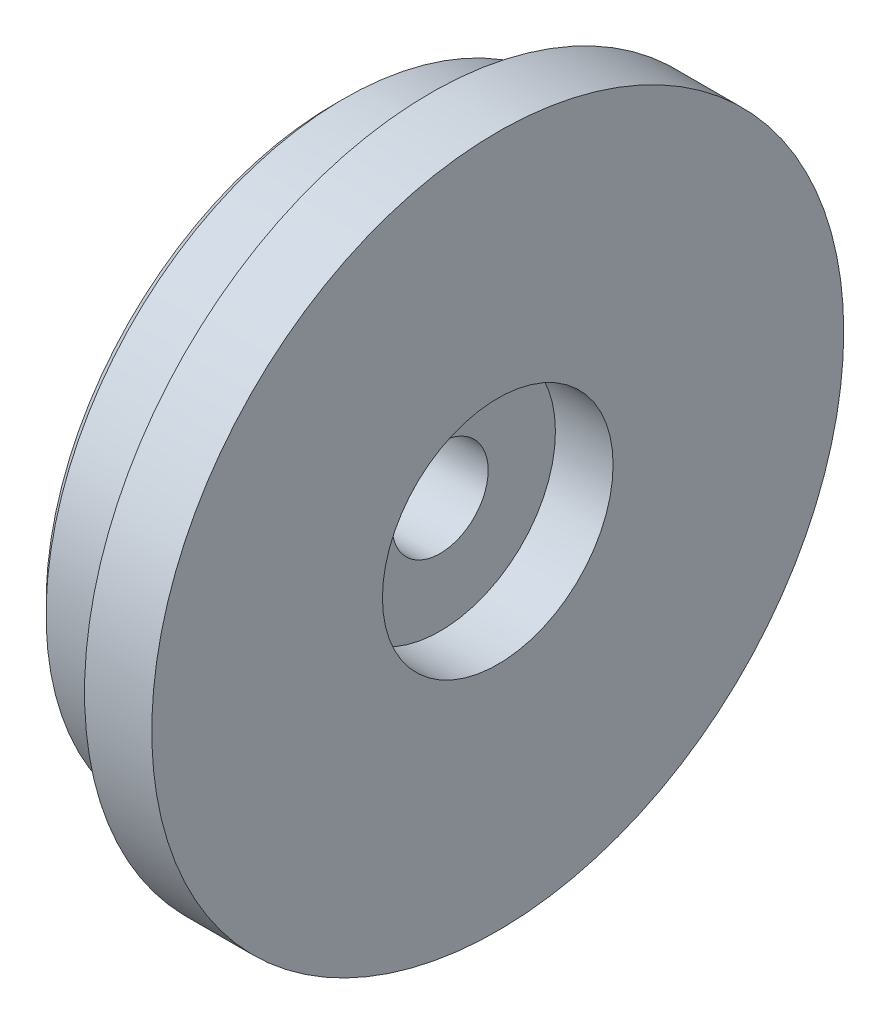
ISO-10303-21;
HEADER;
FILE_DESCRIPTION(('STEP AP214'),'2;1');
FILE_NAME('part.step','',(''),(''),'','','');
FILE_SCHEMA(('AUTOMOTIVE_DESIGN { 1 0 10303 214 1 1 1 1 }'));
ENDSEC;
DATA;
#1=APPLICATION_CONTEXT('core data for automotive mechanical design processes');
#2=APPLICATION_PROTOCOL_DEFINITION('international standard','automotive_design',2000,#1);
#3=PRODUCT_CONTEXT('',#1,'mechanical');
#4=PRODUCT('Part','Part','',(#3));
#5=PRODUCT_RELATED_PRODUCT_CATEGORY('part','',(#4));
#6=PRODUCT_DEFINITION_FORMATION('','',#4);
#7=PRODUCT_DEFINITION_CONTEXT('part definition',#1,'design');
#8=PRODUCT_DEFINITION('design','',#6,#7);
#9=PRODUCT_DEFINITION_SHAPE('','',#8);
#10=(LENGTH_UNIT() NAMED_UNIT(*) SI_UNIT(.MILLI.,.METRE.));
#11=(NAMED_UNIT(*) PLANE_ANGLE_UNIT() SI_UNIT($,.RADIAN.));
#12=(NAMED_UNIT(*) SI_UNIT($,.STERADIAN.) SOLID_ANGLE_UNIT());
#13=UNCERTAINTY_MEASURE_WITH_UNIT(LENGTH_MEASURE(1.E-05),#10,'distance_accuracy_value','');
#14=(GEOMETRIC_REPRESENTATION_CONTEXT(3) GLOBAL_UNCERTAINTY_ASSIGNED_CONTEXT((#13)) GLOBAL_UNIT_ASSIGNED_CONTEXT((#10,
#11,#12)) REPRESENTATION_CONTEXT('',''));
#15=CARTESIAN_POINT('',(0.,0.,0.));
#16=DIRECTION('',(0.,0.,1.));
#17=DIRECTION('',(1.,0.,0.));
#18=AXIS2_PLACEMENT_3D('',#15,#16,#17);
#19=CARTESIAN_POINT('',(0.,18.,0.));
#20=DIRECTION('',(1.,0.,0.));
#21=DIRECTION('',(0.,0.,-1.));
#22=AXIS2_PLACEMENT_3D('',#19,#20,#21);
#23=PLANE('',#22);
#24=CARTESIAN_POINT('',(0.,0.,0.));
#25=DIRECTION('',(1.,0.,0.));
#26=DIRECTION('',(0.,0.,-1.));
#27=AXIS2_PLACEMENT_3D('',#24,#25,#26);
#28=CIRCLE('',#27,18.);
#29=CARTESIAN_POINT('',(0.,0.,-18.));
#30=VERTEX_POINT('',#29);
#31=EDGE_CURVE('E104',#30,#30,#28,.T.);
#32=ORIENTED_EDGE('',*,*,#31,.T.);
#33=EDGE_LOOP('',(#32));
#34=FACE_BOUND('',#33,.T.);
#35=CARTESIAN_POINT('',(0.,0.,0.));
#36=DIRECTION('',(1.,0.,0.));
#37=DIRECTION('',(0.,0.,-1.));
#38=AXIS2_PLACEMENT_3D('',#35,#36,#37);
#39=CIRCLE('',#38,6.);
#40=CARTESIAN_POINT('',(0.,0.,-6.));
#41=VERTEX_POINT('',#40);
#42=EDGE_CURVE('E10',#41,#41,#39,.T.);
#43=ORIENTED_EDGE('',*,*,#42,.F.);
#44=EDGE_LOOP('',(#43));
#45=FACE_BOUND('',#44,.T.);
#46=ADVANCED_FACE('F49',(#34,#45),#23,.T.);
#47=CARTESIAN_POINT('',(0.,0.,0.));
#48=DIRECTION('',(1.,0.,0.));
#49=DIRECTION('',(0.,0.,-1.));
#50=AXIS2_PLACEMENT_3D('',#47,#48,#49);
#51=CYLINDRICAL_SURFACE('',#50,6.);
#52=ORIENTED_EDGE('',*,*,#42,.T.);
#53=EDGE_LOOP('',(#52));
#54=FACE_BOUND('',#53,.T.);
#55=CARTESIAN_POINT('',(-3.,0.,0.));
#56=DIRECTION('',(1.,0.,0.));
#57=DIRECTION('',(0.,0.,-1.));
#58=AXIS2_PLACEMENT_3D('',#55,#56,#57);
#59=CIRCLE('',#58,6.);
#60=CARTESIAN_POINT('',(-3.,0.,-6.));
#61=VERTEX_POINT('',#60);
#62=EDGE_CURVE('E55',#61,#61,#59,.T.);
#63=ORIENTED_EDGE('',*,*,#62,.F.);
#64=EDGE_LOOP('',(#63));
#65=FACE_BOUND('',#64,.T.);
#66=ADVANCED_FACE('F122',(#54,#65),#51,.F.);
#67=CARTESIAN_POINT('',(-3.,6.,0.));
#68=DIRECTION('',(1.,0.,0.));
#69=DIRECTION('',(0.,0.,-1.));
#70=AXIS2_PLACEMENT_3D('',#67,#68,#69);
#71=PLANE('',#70);
#72=ORIENTED_EDGE('',*,*,#62,.T.);
#73=EDGE_LOOP('',(#72));
#74=FACE_BOUND('',#73,.T.);
#75=CARTESIAN_POINT('',(-3.,0.,0.));
#76=DIRECTION('',(1.,0.,0.));
#77=DIRECTION('',(0.,0.,-1.));
#78=AXIS2_PLACEMENT_3D('',#75,#76,#77);
#79=CIRCLE('',#78,2.5);
#80=CARTESIAN_POINT('',(-3.,0.,-2.5));
#81=VERTEX_POINT('',#80);
#82=EDGE_CURVE('E59',#81,#81,#79,.T.);
#83=ORIENTED_EDGE('',*,*,#82,.F.);
#84=EDGE_LOOP('',(#83));
#85=FACE_BOUND('',#84,.T.);
#86=ADVANCED_FACE('F126',(#74,#85),#71,.T.);
#87=CARTESIAN_POINT('',(0.,0.,0.));
#88=DIRECTION('',(1.,0.,0.));
#89=DIRECTION('',(0.,0.,-1.));
#90=AXIS2_PLACEMENT_3D('',#87,#88,#89);
#91=CYLINDRICAL_SURFACE('',#90,2.5);
#92=ORIENTED_EDGE('',*,*,#82,.T.);
#93=EDGE_LOOP('',(#92));
#94=FACE_BOUND('',#93,.T.);
#95=CARTESIAN_POINT('',(-8.5,0.,0.));
#96=DIRECTION('',(1.,0.,0.));
#97=DIRECTION('',(0.,0.,-1.));
#98=AXIS2_PLACEMENT_3D('',#95,#96,#97);
#99=CIRCLE('',#98,2.5);
#100=CARTESIAN_POINT('',(-8.5,0.,-2.5));
#101=VERTEX_POINT('',#100);
#102=EDGE_CURVE('E63',#101,#101,#99,.T.);
#103=ORIENTED_EDGE('',*,*,#102,.F.);
#104=EDGE_LOOP('',(#103));
#105=FACE_BOUND('',#104,.T.);
#106=ADVANCED_FACE('F130',(#94,#105),#91,.F.);
#107=CARTESIAN_POINT('',(-8.5,2.5,0.));
#108=DIRECTION('',(-1.,0.,0.));
#109=DIRECTION('',(0.,0.,1.));
#110=AXIS2_PLACEMENT_3D('',#107,#108,#109);
#111=PLANE('',#110);
#112=ORIENTED_EDGE('',*,*,#102,.T.);
#113=EDGE_LOOP('',(#112));
#114=FACE_BOUND('',#113,.T.);
#115=CARTESIAN_POINT('',(-8.5,0.,0.));
#116=DIRECTION('',(1.,0.,0.));
#117=DIRECTION('',(0.,0.,-1.));
#118=AXIS2_PLACEMENT_3D('',#115,#116,#117);
#119=CIRCLE('',#118,5.);
#120=CARTESIAN_POINT('',(-8.5,0.,-5.));
#121=VERTEX_POINT('',#120);
#122=EDGE_CURVE('E68',#121,#121,#119,.T.);
#123=ORIENTED_EDGE('',*,*,#122,.F.);
#124=EDGE_LOOP('',(#123));
#125=FACE_BOUND('',#124,.T.);
#126=ADVANCED_FACE('F136',(#114,#125),#111,.T.);
#127=CARTESIAN_POINT('',(0.,0.,0.));
#128=DIRECTION('',(1.,0.,0.));
#129=DIRECTION('',(0.,0.,-1.));
#130=AXIS2_PLACEMENT_3D('',#127,#128,#129);
#131=CYLINDRICAL_SURFACE('',#130,5.);
#132=ORIENTED_EDGE('',*,*,#122,.T.);
#133=EDGE_LOOP('',(#132));
#134=FACE_BOUND('',#133,.T.);
#135=CARTESIAN_POINT('',(-5.75,0.,0.));
#136=DIRECTION('',(1.,0.,0.));
#137=DIRECTION('',(0.,0.,-1.));
#138=AXIS2_PLACEMENT_3D('',#135,#136,#137);
#139=CIRCLE('',#138,5.);
#140=CARTESIAN_POINT('',(-5.75,0.,-5.));
#141=VERTEX_POINT('',#140);
#142=EDGE_CURVE('E71',#141,#141,#139,.T.);
#143=ORIENTED_EDGE('',*,*,#142,.F.);
#144=EDGE_LOOP('',(#143));
#145=FACE_BOUND('',#144,.T.);
#146=ADVANCED_FACE('F140',(#134,#145),#131,.T.);
#147=CARTESIAN_POINT('',(-5.,0.,0.));
#148=DIRECTION('',(1.,0.,0.));
#149=DIRECTION('',(0.,0.,-1.));
#150=AXIS2_PLACEMENT_3D('',#147,#148,#149);
#151=CONICAL_SURFACE('',#150,5.75,0.785398163397448);
#152=ORIENTED_EDGE('',*,*,#142,.T.);
#153=EDGE_LOOP('',(#152));
#154=FACE_BOUND('',#153,.T.);
#155=CARTESIAN_POINT('',(-5.,0.,0.));
#156=DIRECTION('',(1.,0.,0.));
#157=DIRECTION('',(0.,0.,-1.));
#158=AXIS2_PLACEMENT_3D('',#155,#156,#157);
#159=CIRCLE('',#158,5.75);
#160=CARTESIAN_POINT('',(-5.,0.,-5.75));
#161=VERTEX_POINT('',#160);
#162=EDGE_CURVE('E74',#161,#161,#159,.T.);
#163=ORIENTED_EDGE('',*,*,#162,.F.);
#164=EDGE_LOOP('',(#163));
#165=FACE_BOUND('',#164,.T.);
#166=ADVANCED_FACE('F144',(#154,#165),#151,.T.);
#167=CARTESIAN_POINT('',(-5.,5.75,0.));
#168=DIRECTION('',(-1.,0.,0.));
#169=DIRECTION('',(0.,0.,1.));
#170=AXIS2_PLACEMENT_3D('',#167,#168,#169);
#171=PLANE('',#170);
#172=ORIENTED_EDGE('',*,*,#162,.T.);
#173=EDGE_LOOP('',(#172));
#174=FACE_BOUND('',#173,.T.);
#175=CARTESIAN_POINT('',(-5.,0.,0.));
#176=DIRECTION('',(1.,0.,0.));
#177=DIRECTION('',(0.,0.,-1.));
#178=AXIS2_PLACEMENT_3D('',#175,#176,#177);
#179=CIRCLE('',#178,11.25);
#180=CARTESIAN_POINT('',(-5.,0.,-11.25));
#181=VERTEX_POINT('',#180);
#182=EDGE_CURVE('E77',#181,#181,#179,.T.);
#183=ORIENTED_EDGE('',*,*,#182,.F.);
#184=EDGE_LOOP('',(#183));
#185=FACE_BOUND('',#184,.T.);
#186=ADVANCED_FACE('F148',(#174,#185),#171,.T.);
#187=CARTESIAN_POINT('',(-5.75,0.,0.));
#188=DIRECTION('',(-1.,0.,0.));
#189=DIRECTION('',(0.,0.,1.));
#190=AXIS2_PLACEMENT_3D('',#187,#188,#189);
#191=CONICAL_SURFACE('',#190,12.,0.785398163397449);
#192=ORIENTED_EDGE('',*,*,#182,.T.);
#193=EDGE_LOOP('',(#192));
#194=FACE_BOUND('',#193,.T.);
#195=CARTESIAN_POINT('',(-5.75,0.,0.));
#196=DIRECTION('',(1.,0.,0.));
#197=DIRECTION('',(0.,0.,-1.));
#198=AXIS2_PLACEMENT_3D('',#195,#196,#197);
#199=CIRCLE('',#198,12.);
#200=CARTESIAN_POINT('',(-5.75,0.,-12.));
#201=VERTEX_POINT('',#200);
#202=EDGE_CURVE('E80',#201,#201,#199,.T.);
#203=ORIENTED_EDGE('',*,*,#202,.F.);
#204=EDGE_LOOP('',(#203));
#205=FACE_BOUND('',#204,.T.);
#206=ADVANCED_FACE('F152',(#194,#205),#191,.F.);
#207=CARTESIAN_POINT('',(0.,0.,0.));
#208=DIRECTION('',(1.,0.,0.));
#209=DIRECTION('',(0.,0.,-1.));
#210=AXIS2_PLACEMENT_3D('',#207,#208,#209);
#211=CYLINDRICAL_SURFACE('',#210,12.);
#212=ORIENTED_EDGE('',*,*,#202,.T.);
#213=EDGE_LOOP('',(#212));
#214=FACE_BOUND('',#213,.T.);
#215=CARTESIAN_POINT('',(-8.5,0.,0.));
#216=DIRECTION('',(1.,0.,0.));
#217=DIRECTION('',(0.,0.,-1.));
#218=AXIS2_PLACEMENT_3D('',#215,#216,#217);
#219=CIRCLE('',#218,12.);
#220=CARTESIAN_POINT('',(-8.5,0.,-12.));
#221=VERTEX_POINT('',#220);
#222=EDGE_CURVE('E83',#221,#221,#219,.T.);
#223=ORIENTED_EDGE('',*,*,#222,.F.);
#224=EDGE_LOOP('',(#223));
#225=FACE_BOUND('',#224,.T.);
#226=ADVANCED_FACE('F156',(#214,#225),#211,.F.);
#227=CARTESIAN_POINT('',(-8.5,12.,0.));
#228=DIRECTION('',(-1.,0.,0.));
#229=DIRECTION('',(0.,0.,1.));
#230=AXIS2_PLACEMENT_3D('',#227,#228,#229);
#231=PLANE('',#230);
#232=ORIENTED_EDGE('',*,*,#222,.T.);
#233=EDGE_LOOP('',(#232));
#234=FACE_BOUND('',#233,.T.);
#235=CARTESIAN_POINT('',(-8.5,0.,0.));
#236=DIRECTION('',(1.,0.,0.));
#237=DIRECTION('',(0.,0.,-1.));
#238=AXIS2_PLACEMENT_3D('',#235,#236,#237);
#239=CIRCLE('',#238,15.);
#240=CARTESIAN_POINT('',(-8.5,0.,-15.));
#241=VERTEX_POINT('',#240);
#242=EDGE_CURVE('E86',#241,#241,#239,.T.);
#243=ORIENTED_EDGE('',*,*,#242,.F.);
#244=EDGE_LOOP('',(#243));
#245=FACE_BOUND('',#244,.T.);
#246=ADVANCED_FACE('F160',(#234,#245),#231,.T.);
#247=CARTESIAN_POINT('',(-8.,0.,0.));
#248=DIRECTION('',(1.,0.,0.));
#249=DIRECTION('',(0.,0.,-1.));
#250=AXIS2_PLACEMENT_3D('',#247,#248,#249);
#251=CONICAL_SURFACE('',#250,15.5,0.785398163397448);
#252=ORIENTED_EDGE('',*,*,#242,.T.);
#253=EDGE_LOOP('',(#252));
#254=FACE_BOUND('',#253,.T.);
#255=CARTESIAN_POINT('',(-8.,0.,0.));
#256=DIRECTION('',(1.,0.,0.));
#257=DIRECTION('',(0.,0.,-1.));
#258=AXIS2_PLACEMENT_3D('',#255,#256,#257);
#259=CIRCLE('',#258,15.5);
#260=CARTESIAN_POINT('',(-8.,0.,-15.5));
#261=VERTEX_POINT('',#260);
#262=EDGE_CURVE('E89',#261,#261,#259,.T.);
#263=ORIENTED_EDGE('',*,*,#262,.F.);
#264=EDGE_LOOP('',(#263));
#265=FACE_BOUND('',#264,.T.);
#266=ADVANCED_FACE('F164',(#254,#265),#251,.T.);
#267=CARTESIAN_POINT('',(0.,0.,0.));
#268=DIRECTION('',(1.,0.,0.));
#269=DIRECTION('',(0.,0.,-1.));
#270=AXIS2_PLACEMENT_3D('',#267,#268,#269);
#271=CYLINDRICAL_SURFACE('',#270,15.5);
#272=ORIENTED_EDGE('',*,*,#262,.T.);
#273=EDGE_LOOP('',(#272));
#274=FACE_BOUND('',#273,.T.);
#275=CARTESIAN_POINT('',(-4.5,0.,0.));
#276=DIRECTION('',(1.,0.,0.));
#277=DIRECTION('',(0.,0.,-1.));
#278=AXIS2_PLACEMENT_3D('',#275,#276,#277);
#279=CIRCLE('',#278,15.5);
#280=CARTESIAN_POINT('',(-4.5,0.,-15.5));
#281=VERTEX_POINT('',#280);
#282=EDGE_CURVE('E92',#281,#281,#279,.T.);
#283=ORIENTED_EDGE('',*,*,#282,.F.);
#284=EDGE_LOOP('',(#283));
#285=FACE_BOUND('',#284,.T.);
#286=ADVANCED_FACE('F168',(#274,#285),#271,.T.);
#287=CARTESIAN_POINT('',(-4.5,15.,0.));
#288=DIRECTION('',(1.,0.,0.));
#289=DIRECTION('',(0.,0.,-1.));
#290=AXIS2_PLACEMENT_3D('',#287,#288,#289);
#291=PLANE('',#290);
#292=ORIENTED_EDGE('',*,*,#282,.T.);
#293=EDGE_LOOP('',(#292));
#294=FACE_BOUND('',#293,.T.);
#295=CARTESIAN_POINT('',(-4.5,0.,0.));
#296=DIRECTION('',(1.,0.,0.));
#297=DIRECTION('',(0.,0.,-1.));
#298=AXIS2_PLACEMENT_3D('',#295,#296,#297);
#299=CIRCLE('',#298,15.);
#300=CARTESIAN_POINT('',(-4.5,0.,-15.));
#301=VERTEX_POINT('',#300);
#302=EDGE_CURVE('E95',#301,#301,#299,.T.);
#303=ORIENTED_EDGE('',*,*,#302,.F.);
#304=EDGE_LOOP('',(#303));
#305=FACE_BOUND('',#304,.T.);
#306=ADVANCED_FACE('F172',(#294,#305),#291,.T.);
#307=CARTESIAN_POINT('',(0.,0.,0.));
#308=DIRECTION('',(1.,0.,0.));
#309=DIRECTION('',(0.,0.,-1.));
#310=AXIS2_PLACEMENT_3D('',#307,#308,#309);
#311=CYLINDRICAL_SURFACE('',#310,15.);
#312=ORIENTED_EDGE('',*,*,#302,.T.);
#313=EDGE_LOOP('',(#312));
#314=FACE_BOUND('',#313,.T.);
#315=CARTESIAN_POINT('',(-3.5,0.,0.));
#316=DIRECTION('',(1.,0.,0.));
#317=DIRECTION('',(0.,0.,-1.));
#318=AXIS2_PLACEMENT_3D('',#315,#316,#317);
#319=CIRCLE('',#318,15.);
#320=CARTESIAN_POINT('',(-3.5,0.,-15.));
#321=VERTEX_POINT('',#320);
#322=EDGE_CURVE('E98',#321,#321,#319,.T.);
#323=ORIENTED_EDGE('',*,*,#322,.F.);
#324=EDGE_LOOP('',(#323));
#325=FACE_BOUND('',#324,.T.);
#326=ADVANCED_FACE('F118',(#314,#325),#311,.T.);
#327=CARTESIAN_POINT('',(-3.5,18.,0.));
#328=DIRECTION('',(-1.,0.,0.));
#329=DIRECTION('',(0.,0.,1.));
#330=AXIS2_PLACEMENT_3D('',#327,#328,#329);
#331=PLANE('',#330);
#332=ORIENTED_EDGE('',*,*,#322,.T.);
#333=EDGE_LOOP('',(#332));
#334=FACE_BOUND('',#333,.T.);
#335=CARTESIAN_POINT('',(-3.5,0.,0.));
#336=DIRECTION('',(1.,0.,0.));
#337=DIRECTION('',(0.,0.,-1.));
#338=AXIS2_PLACEMENT_3D('',#335,#336,#337);
#339=CIRCLE('',#338,18.);
#340=CARTESIAN_POINT('',(-3.5,0.,-18.));
#341=VERTEX_POINT('',#340);
#342=EDGE_CURVE('E101',#341,#341,#339,.T.);
#343=ORIENTED_EDGE('',*,*,#342,.F.);
#344=EDGE_LOOP('',(#343));
#345=FACE_BOUND('',#344,.T.);
#346=ADVANCED_FACE('F112',(#334,#345),#331,.T.);
#347=CARTESIAN_POINT('',(0.,0.,0.));
#348=DIRECTION('',(1.,0.,0.));
#349=DIRECTION('',(0.,0.,-1.));
#350=AXIS2_PLACEMENT_3D('',#347,#348,#349);
#351=CYLINDRICAL_SURFACE('',#350,18.);
#352=ORIENTED_EDGE('',*,*,#342,.T.);
#353=EDGE_LOOP('',(#352));
#354=FACE_BOUND('',#353,.T.);
#355=ORIENTED_EDGE('',*,*,#31,.F.);
#356=EDGE_LOOP('',(#355));
#357=FACE_BOUND('',#356,.T.);
#358=ADVANCED_FACE('F110',(#354,#357),#351,.T.);
#359=CLOSED_SHELL('',(#46,#66,#86,#106,#126,#146,#166,#186,#206,#226,#246,#266,#286,#306,#326,
#346,#358));
#360=MANIFOLD_SOLID_BREP('B2',#359);
#361=ADVANCED_BREP_SHAPE_REPRESENTATION('',(#18,#360),#14);
#362=SHAPE_DEFINITION_REPRESENTATION(#9,#361);
ENDSEC;
END-ISO-10303-21;
